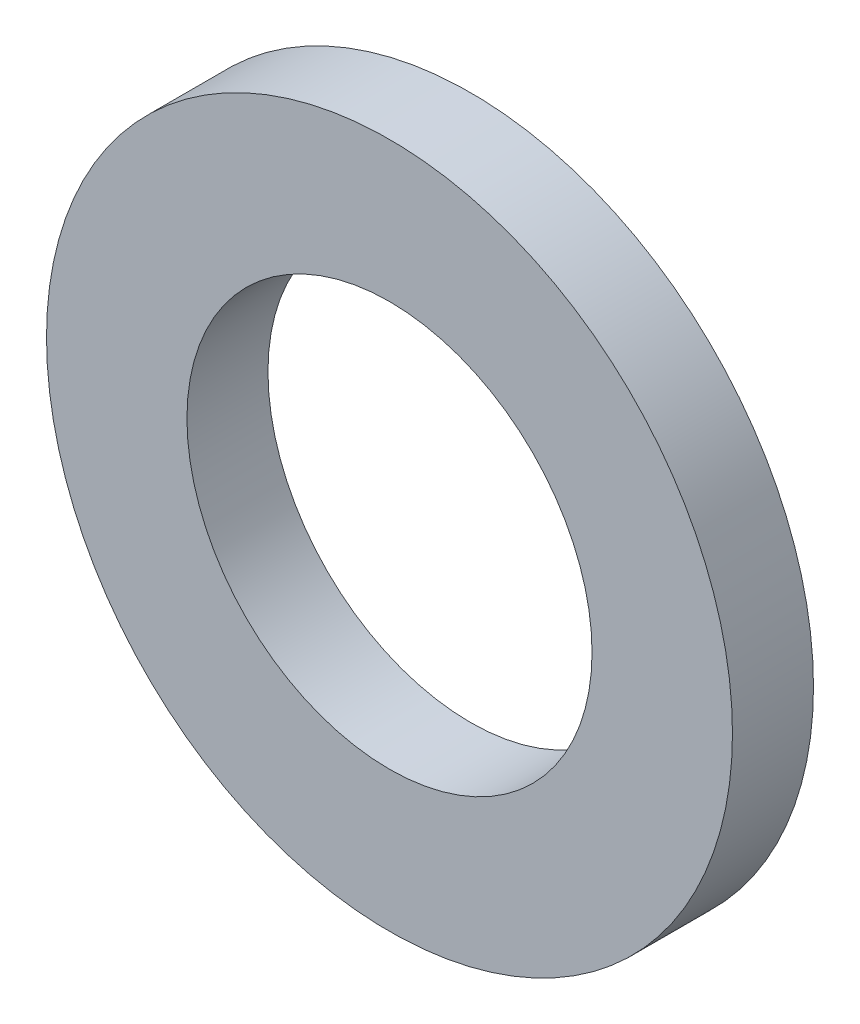
ISO-10303-21;
HEADER;
FILE_DESCRIPTION(('STEP AP214'),'2;1');
FILE_NAME('part.step','',(''),(''),'','','');
FILE_SCHEMA(('AUTOMOTIVE_DESIGN { 1 0 10303 214 1 1 1 1 }'));
ENDSEC;
DATA;
#1=APPLICATION_CONTEXT('core data for automotive mechanical design processes');
#2=APPLICATION_PROTOCOL_DEFINITION('international standard','automotive_design',2000,#1);
#3=PRODUCT_CONTEXT('',#1,'mechanical');
#4=PRODUCT('Part','Part','',(#3));
#5=PRODUCT_RELATED_PRODUCT_CATEGORY('part','',(#4));
#6=PRODUCT_DEFINITION_FORMATION('','',#4);
#7=PRODUCT_DEFINITION_CONTEXT('part definition',#1,'design');
#8=PRODUCT_DEFINITION('design','',#6,#7);
#9=PRODUCT_DEFINITION_SHAPE('','',#8);
#10=(LENGTH_UNIT() NAMED_UNIT(*) SI_UNIT(.MILLI.,.METRE.));
#11=(NAMED_UNIT(*) PLANE_ANGLE_UNIT() SI_UNIT($,.RADIAN.));
#12=(NAMED_UNIT(*) SI_UNIT($,.STERADIAN.) SOLID_ANGLE_UNIT());
#13=UNCERTAINTY_MEASURE_WITH_UNIT(LENGTH_MEASURE(1.E-05),#10,'distance_accuracy_value','');
#14=(GEOMETRIC_REPRESENTATION_CONTEXT(3) GLOBAL_UNCERTAINTY_ASSIGNED_CONTEXT((#13)) GLOBAL_UNIT_ASSIGNED_CONTEXT((#10,
#11,#12)) REPRESENTATION_CONTEXT('',''));
#15=CARTESIAN_POINT('',(0.,0.,0.));
#16=DIRECTION('',(0.,0.,1.));
#17=DIRECTION('',(1.,0.,0.));
#18=AXIS2_PLACEMENT_3D('',#15,#16,#17);
#19=CARTESIAN_POINT('',(0.,0.,24.));
#20=DIRECTION('',(0.,0.,1.));
#21=DIRECTION('',(1.,0.,0.));
#22=AXIS2_PLACEMENT_3D('',#19,#20,#21);
#23=PLANE('',#22);
#24=CARTESIAN_POINT('',(0.,0.,24.));
#25=DIRECTION('',(0.,0.,1.));
#26=DIRECTION('',(1.,0.,0.));
#27=AXIS2_PLACEMENT_3D('',#24,#25,#26);
#28=CIRCLE('',#27,101.6);
#29=CARTESIAN_POINT('',(101.6,0.,24.));
#30=VERTEX_POINT('',#29);
#31=EDGE_CURVE('E10',#30,#30,#28,.T.);
#32=ORIENTED_EDGE('',*,*,#31,.T.);
#33=EDGE_LOOP('',(#32));
#34=FACE_BOUND('',#33,.T.);
#35=CARTESIAN_POINT('',(0.,0.,24.));
#36=DIRECTION('',(0.,0.,1.));
#37=DIRECTION('',(1.,0.,0.));
#38=AXIS2_PLACEMENT_3D('',#35,#36,#37);
#39=CIRCLE('',#38,60.);
#40=CARTESIAN_POINT('',(60.,0.,24.));
#41=VERTEX_POINT('',#40);
#42=EDGE_CURVE('E45',#41,#41,#39,.T.);
#43=ORIENTED_EDGE('',*,*,#42,.F.);
#44=EDGE_LOOP('',(#43));
#45=FACE_BOUND('',#44,.T.);
#46=ADVANCED_FACE('F34',(#34,#45),#23,.T.);
#47=CARTESIAN_POINT('',(0.,0.,0.));
#48=DIRECTION('',(0.,0.,1.));
#49=DIRECTION('',(1.,0.,0.));
#50=AXIS2_PLACEMENT_3D('',#47,#48,#49);
#51=PLANE('',#50);
#52=CARTESIAN_POINT('',(0.,0.,0.));
#53=DIRECTION('',(0.,0.,1.));
#54=DIRECTION('',(1.,0.,0.));
#55=AXIS2_PLACEMENT_3D('',#52,#53,#54);
#56=CIRCLE('',#55,101.6);
#57=CARTESIAN_POINT('',(101.6,0.,0.));
#58=VERTEX_POINT('',#57);
#59=EDGE_CURVE('E38',#58,#58,#56,.T.);
#60=ORIENTED_EDGE('',*,*,#59,.F.);
#61=EDGE_LOOP('',(#60));
#62=FACE_BOUND('',#61,.T.);
#63=CARTESIAN_POINT('',(0.,0.,0.));
#64=DIRECTION('',(0.,0.,1.));
#65=DIRECTION('',(1.,0.,0.));
#66=AXIS2_PLACEMENT_3D('',#63,#64,#65);
#67=CIRCLE('',#66,60.);
#68=CARTESIAN_POINT('',(60.,0.,0.));
#69=VERTEX_POINT('',#68);
#70=EDGE_CURVE('E47',#69,#69,#67,.T.);
#71=ORIENTED_EDGE('',*,*,#70,.T.);
#72=EDGE_LOOP('',(#71));
#73=FACE_BOUND('',#72,.T.);
#74=ADVANCED_FACE('F57',(#62,#73),#51,.F.);
#75=CARTESIAN_POINT('',(0.,0.,24.));
#76=DIRECTION('',(0.,0.,-1.));
#77=DIRECTION('',(-1.,0.,0.));
#78=AXIS2_PLACEMENT_3D('',#75,#76,#77);
#79=CYLINDRICAL_SURFACE('',#78,101.6);
#80=ORIENTED_EDGE('',*,*,#31,.F.);
#81=EDGE_LOOP('',(#80));
#82=FACE_BOUND('',#81,.T.);
#83=ORIENTED_EDGE('',*,*,#59,.T.);
#84=EDGE_LOOP('',(#83));
#85=FACE_BOUND('',#84,.T.);
#86=ADVANCED_FACE('F36',(#82,#85),#79,.T.);
#87=CARTESIAN_POINT('',(0.,0.,24.));
#88=DIRECTION('',(0.,0.,-1.));
#89=DIRECTION('',(-1.,0.,0.));
#90=AXIS2_PLACEMENT_3D('',#87,#88,#89);
#91=CYLINDRICAL_SURFACE('',#90,60.);
#92=ORIENTED_EDGE('',*,*,#42,.T.);
#93=EDGE_LOOP('',(#92));
#94=FACE_BOUND('',#93,.T.);
#95=ORIENTED_EDGE('',*,*,#70,.F.);
#96=EDGE_LOOP('',(#95));
#97=FACE_BOUND('',#96,.T.);
#98=ADVANCED_FACE('F53',(#94,#97),#91,.F.);
#99=CLOSED_SHELL('',(#46,#74,#86,#98));
#100=MANIFOLD_SOLID_BREP('B2',#99);
#101=ADVANCED_BREP_SHAPE_REPRESENTATION('',(#18,#100),#14);
#102=SHAPE_DEFINITION_REPRESENTATION(#9,#101);
ENDSEC;
END-ISO-10303-21;
